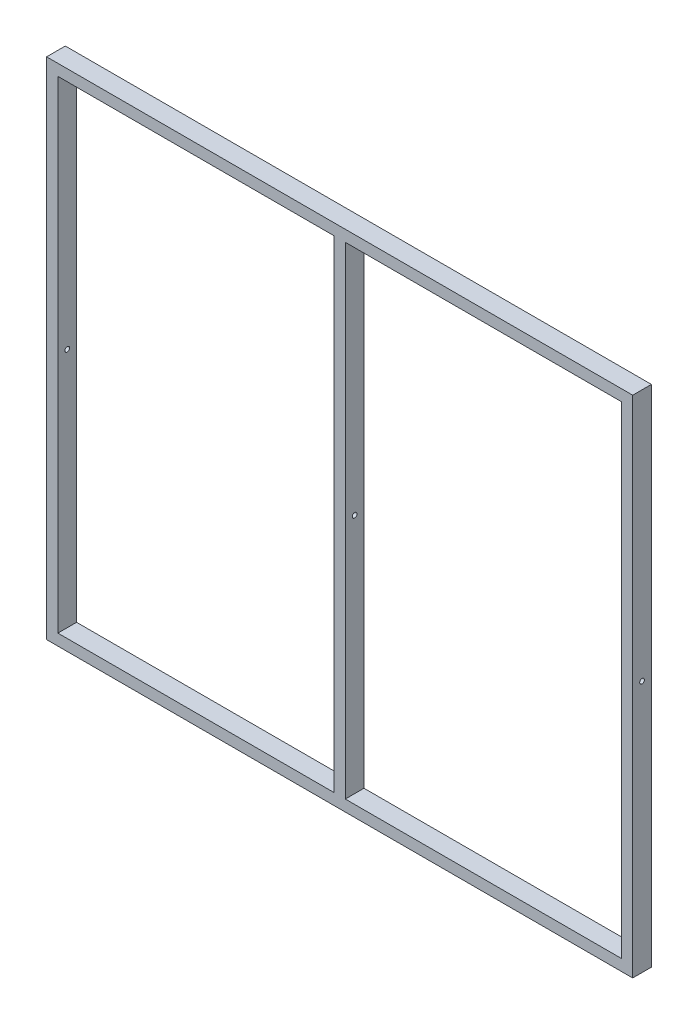
ISO-10303-21;
HEADER;
FILE_DESCRIPTION(('STEP AP214'),'2;1');
FILE_NAME('part.step','',(''),(''),'','','');
FILE_SCHEMA(('AUTOMOTIVE_DESIGN { 1 0 10303 214 1 1 1 1 }'));
ENDSEC;
DATA;
#1=APPLICATION_CONTEXT('core data for automotive mechanical design processes');
#2=APPLICATION_PROTOCOL_DEFINITION('international standard','automotive_design',2000,#1);
#3=PRODUCT_CONTEXT('',#1,'mechanical');
#4=PRODUCT('Part','Part','',(#3));
#5=PRODUCT_RELATED_PRODUCT_CATEGORY('part','',(#4));
#6=PRODUCT_DEFINITION_FORMATION('','',#4);
#7=PRODUCT_DEFINITION_CONTEXT('part definition',#1,'design');
#8=PRODUCT_DEFINITION('design','',#6,#7);
#9=PRODUCT_DEFINITION_SHAPE('','',#8);
#10=(LENGTH_UNIT() NAMED_UNIT(*) SI_UNIT(.MILLI.,.METRE.));
#11=(NAMED_UNIT(*) PLANE_ANGLE_UNIT() SI_UNIT($,.RADIAN.));
#12=(NAMED_UNIT(*) SI_UNIT($,.STERADIAN.) SOLID_ANGLE_UNIT());
#13=UNCERTAINTY_MEASURE_WITH_UNIT(LENGTH_MEASURE(1.E-05),#10,'distance_accuracy_value','');
#14=(GEOMETRIC_REPRESENTATION_CONTEXT(3) GLOBAL_UNCERTAINTY_ASSIGNED_CONTEXT((#13)) GLOBAL_UNIT_ASSIGNED_CONTEXT((#10,
#11,#12)) REPRESENTATION_CONTEXT('',''));
#15=CARTESIAN_POINT('',(0.,0.,0.));
#16=DIRECTION('',(0.,0.,1.));
#17=DIRECTION('',(1.,0.,0.));
#18=AXIS2_PLACEMENT_3D('',#15,#16,#17);
#19=CARTESIAN_POINT('',(0.,1662.,63.));
#20=DIRECTION('',(0.,1.,0.));
#21=DIRECTION('',(0.,0.,1.));
#22=AXIS2_PLACEMENT_3D('',#19,#20,#21);
#23=PLANE('',#22);
#24=DIRECTION('',(1.,0.,0.));
#25=VECTOR('',#24,1.);
#26=CARTESIAN_POINT('',(0.,1662.,0.));
#27=LINE('',#26,#25);
#28=CARTESIAN_POINT('',(38.0000000000002,1662.,0.));
#29=VERTEX_POINT('',#28);
#30=CARTESIAN_POINT('',(968.,1662.,0.));
#31=VERTEX_POINT('',#30);
#32=EDGE_CURVE('E180',#29,#31,#27,.T.);
#33=ORIENTED_EDGE('',*,*,#32,.T.);
#34=DIRECTION('',(0.,0.,-1.));
#35=VECTOR('',#34,1.);
#36=CARTESIAN_POINT('',(968.,1662.,63.));
#37=LINE('',#36,#35);
#38=CARTESIAN_POINT('',(968.,1662.,63.));
#39=VERTEX_POINT('',#38);
#40=EDGE_CURVE('E11',#39,#31,#37,.T.);
#41=ORIENTED_EDGE('',*,*,#40,.F.);
#42=DIRECTION('',(1.,0.,0.));
#43=VECTOR('',#42,1.);
#44=CARTESIAN_POINT('',(0.,1662.,63.));
#45=LINE('',#44,#43);
#46=CARTESIAN_POINT('',(38.0000000000002,1662.,63.));
#47=VERTEX_POINT('',#46);
#48=EDGE_CURVE('E139',#47,#39,#45,.T.);
#49=ORIENTED_EDGE('',*,*,#48,.F.);
#50=DIRECTION('',(0.,0.,-1.));
#51=VECTOR('',#50,1.);
#52=CARTESIAN_POINT('',(38.0000000000002,1662.,63.));
#53=LINE('',#52,#51);
#54=EDGE_CURVE('E54',#47,#29,#53,.T.);
#55=ORIENTED_EDGE('',*,*,#54,.T.);
#56=EDGE_LOOP('',(#33,#41,#49,#55));
#57=FACE_BOUND('',#56,.T.);
#58=ADVANCED_FACE('F35',(#57),#23,.F.);
#59=CARTESIAN_POINT('',(968.,0.,63.));
#60=DIRECTION('',(1.,0.,0.));
#61=DIRECTION('',(0.,0.,-1.));
#62=AXIS2_PLACEMENT_3D('',#59,#60,#61);
#63=PLANE('',#62);
#64=CARTESIAN_POINT('',(968.,850.,31.5));
#65=DIRECTION('',(1.,0.,0.));
#66=DIRECTION('',(0.,0.,-1.));
#67=AXIS2_PLACEMENT_3D('',#64,#65,#66);
#68=CIRCLE('',#67,8.00000000000001);
#69=CARTESIAN_POINT('',(968.,850.,23.5));
#70=VERTEX_POINT('',#69);
#71=EDGE_CURVE('E160',#70,#70,#68,.T.);
#72=ORIENTED_EDGE('',*,*,#71,.T.);
#73=EDGE_LOOP('',(#72));
#74=FACE_BOUND('',#73,.T.);
#75=DIRECTION('',(0.,-1.,0.));
#76=VECTOR('',#75,1.);
#77=CARTESIAN_POINT('',(968.,0.,0.));
#78=LINE('',#77,#76);
#79=CARTESIAN_POINT('',(968.,38.,0.));
#80=VERTEX_POINT('',#79);
#81=EDGE_CURVE('E145',#31,#80,#78,.T.);
#82=ORIENTED_EDGE('',*,*,#81,.T.);
#83=DIRECTION('',(0.,0.,-1.));
#84=VECTOR('',#83,1.);
#85=CARTESIAN_POINT('',(968.,38.,63.));
#86=LINE('',#85,#84);
#87=CARTESIAN_POINT('',(968.,38.,63.));
#88=VERTEX_POINT('',#87);
#89=EDGE_CURVE('E45',#88,#80,#86,.T.);
#90=ORIENTED_EDGE('',*,*,#89,.F.);
#91=DIRECTION('',(0.,-1.,0.));
#92=VECTOR('',#91,1.);
#93=CARTESIAN_POINT('',(968.,0.,63.));
#94=LINE('',#93,#92);
#95=EDGE_CURVE('E133',#39,#88,#94,.T.);
#96=ORIENTED_EDGE('',*,*,#95,.F.);
#97=ORIENTED_EDGE('',*,*,#40,.T.);
#98=EDGE_LOOP('',(#82,#90,#96,#97));
#99=FACE_BOUND('',#98,.T.);
#100=ADVANCED_FACE('F144',(#74,#99),#63,.F.);
#101=CARTESIAN_POINT('',(0.,38.,63.));
#102=DIRECTION('',(0.,1.,0.));
#103=DIRECTION('',(0.,0.,1.));
#104=AXIS2_PLACEMENT_3D('',#101,#102,#103);
#105=PLANE('',#104);
#106=DIRECTION('',(1.,0.,0.));
#107=VECTOR('',#106,1.);
#108=CARTESIAN_POINT('',(0.,38.,0.));
#109=LINE('',#108,#107);
#110=CARTESIAN_POINT('',(38.0000000000001,38.,0.));
#111=VERTEX_POINT('',#110);
#112=EDGE_CURVE('E183',#111,#80,#109,.T.);
#113=ORIENTED_EDGE('',*,*,#112,.F.);
#114=DIRECTION('',(0.,0.,-1.));
#115=VECTOR('',#114,1.);
#116=CARTESIAN_POINT('',(38.0000000000001,38.,63.));
#117=LINE('',#116,#115);
#118=CARTESIAN_POINT('',(38.0000000000001,38.,63.));
#119=VERTEX_POINT('',#118);
#120=EDGE_CURVE('E92',#119,#111,#117,.T.);
#121=ORIENTED_EDGE('',*,*,#120,.F.);
#122=DIRECTION('',(1.,0.,0.));
#123=VECTOR('',#122,1.);
#124=CARTESIAN_POINT('',(0.,38.,63.));
#125=LINE('',#124,#123);
#126=EDGE_CURVE('E138',#119,#88,#125,.T.);
#127=ORIENTED_EDGE('',*,*,#126,.T.);
#128=ORIENTED_EDGE('',*,*,#89,.T.);
#129=EDGE_LOOP('',(#113,#121,#127,#128));
#130=FACE_BOUND('',#129,.T.);
#131=ADVANCED_FACE('F149',(#130),#105,.T.);
#132=CARTESIAN_POINT('',(0.,0.,63.));
#133=DIRECTION('',(0.,1.,0.));
#134=DIRECTION('',(0.,0.,1.));
#135=AXIS2_PLACEMENT_3D('',#132,#133,#134);
#136=PLANE('',#135);
#137=DIRECTION('',(1.,0.,0.));
#138=VECTOR('',#137,1.);
#139=CARTESIAN_POINT('',(0.,0.,0.));
#140=LINE('',#139,#138);
#141=CARTESIAN_POINT('',(0.,0.,0.));
#142=VERTEX_POINT('',#141);
#143=CARTESIAN_POINT('',(1974.,0.,0.));
#144=VERTEX_POINT('',#143);
#145=EDGE_CURVE('E168',#142,#144,#140,.T.);
#146=ORIENTED_EDGE('',*,*,#145,.T.);
#147=DIRECTION('',(0.,0.,-1.));
#148=VECTOR('',#147,1.);
#149=CARTESIAN_POINT('',(1974.,0.,63.));
#150=LINE('',#149,#148);
#151=CARTESIAN_POINT('',(1974.,0.,63.));
#152=VERTEX_POINT('',#151);
#153=EDGE_CURVE('E190',#152,#144,#150,.T.);
#154=ORIENTED_EDGE('',*,*,#153,.F.);
#155=DIRECTION('',(1.,0.,0.));
#156=VECTOR('',#155,1.);
#157=CARTESIAN_POINT('',(0.,0.,63.));
#158=LINE('',#157,#156);
#159=CARTESIAN_POINT('',(0.,0.,63.));
#160=VERTEX_POINT('',#159);
#161=EDGE_CURVE('E228',#160,#152,#158,.T.);
#162=ORIENTED_EDGE('',*,*,#161,.F.);
#163=DIRECTION('',(0.,0.,-1.));
#164=VECTOR('',#163,1.);
#165=CARTESIAN_POINT('',(0.,0.,63.));
#166=LINE('',#165,#164);
#167=EDGE_CURVE('E192',#160,#142,#166,.T.);
#168=ORIENTED_EDGE('',*,*,#167,.T.);
#169=EDGE_LOOP('',(#146,#154,#162,#168));
#170=FACE_BOUND('',#169,.T.);
#171=ADVANCED_FACE('F257',(#170),#136,.F.);
#172=CARTESIAN_POINT('',(1974.,0.,63.));
#173=DIRECTION('',(-1.,0.,0.));
#174=DIRECTION('',(0.,0.,1.));
#175=AXIS2_PLACEMENT_3D('',#172,#173,#174);
#176=PLANE('',#175);
#177=CARTESIAN_POINT('',(1974.,850.,31.5));
#178=DIRECTION('',(1.,0.,0.));
#179=DIRECTION('',(0.,0.,-1.));
#180=AXIS2_PLACEMENT_3D('',#177,#178,#179);
#181=CIRCLE('',#180,8.00000000000001);
#182=CARTESIAN_POINT('',(1974.,850.,23.5));
#183=VERTEX_POINT('',#182);
#184=EDGE_CURVE('E293',#183,#183,#181,.T.);
#185=ORIENTED_EDGE('',*,*,#184,.F.);
#186=EDGE_LOOP('',(#185));
#187=FACE_BOUND('',#186,.T.);
#188=DIRECTION('',(0.,1.,0.));
#189=VECTOR('',#188,1.);
#190=CARTESIAN_POINT('',(1974.,0.,0.));
#191=LINE('',#190,#189);
#192=CARTESIAN_POINT('',(1974.,1700.,0.));
#193=VERTEX_POINT('',#192);
#194=EDGE_CURVE('E171',#144,#193,#191,.T.);
#195=ORIENTED_EDGE('',*,*,#194,.T.);
#196=DIRECTION('',(0.,0.,-1.));
#197=VECTOR('',#196,1.);
#198=CARTESIAN_POINT('',(1974.,1700.,63.));
#199=LINE('',#198,#197);
#200=CARTESIAN_POINT('',(1974.,1700.,63.));
#201=VERTEX_POINT('',#200);
#202=EDGE_CURVE('E196',#201,#193,#199,.T.);
#203=ORIENTED_EDGE('',*,*,#202,.F.);
#204=DIRECTION('',(0.,1.,0.));
#205=VECTOR('',#204,1.);
#206=CARTESIAN_POINT('',(1974.,0.,63.));
#207=LINE('',#206,#205);
#208=EDGE_CURVE('E235',#152,#201,#207,.T.);
#209=ORIENTED_EDGE('',*,*,#208,.F.);
#210=ORIENTED_EDGE('',*,*,#153,.T.);
#211=EDGE_LOOP('',(#195,#203,#209,#210));
#212=FACE_BOUND('',#211,.T.);
#213=ADVANCED_FACE('F259',(#187,#212),#176,.F.);
#214=CARTESIAN_POINT('',(0.,1700.,63.));
#215=DIRECTION('',(0.,1.,0.));
#216=DIRECTION('',(0.,0.,1.));
#217=AXIS2_PLACEMENT_3D('',#214,#215,#216);
#218=PLANE('',#217);
#219=DIRECTION('',(1.,0.,0.));
#220=VECTOR('',#219,1.);
#221=CARTESIAN_POINT('',(0.,1700.,0.));
#222=LINE('',#221,#220);
#223=CARTESIAN_POINT('',(0.,1700.,0.));
#224=VERTEX_POINT('',#223);
#225=EDGE_CURVE('E174',#224,#193,#222,.T.);
#226=ORIENTED_EDGE('',*,*,#225,.F.);
#227=DIRECTION('',(0.,0.,-1.));
#228=VECTOR('',#227,1.);
#229=CARTESIAN_POINT('',(0.,1700.,63.));
#230=LINE('',#229,#228);
#231=CARTESIAN_POINT('',(0.,1700.,63.));
#232=VERTEX_POINT('',#231);
#233=EDGE_CURVE('E194',#232,#224,#230,.T.);
#234=ORIENTED_EDGE('',*,*,#233,.F.);
#235=DIRECTION('',(1.,0.,0.));
#236=VECTOR('',#235,1.);
#237=CARTESIAN_POINT('',(0.,1700.,63.));
#238=LINE('',#237,#236);
#239=EDGE_CURVE('E237',#232,#201,#238,.T.);
#240=ORIENTED_EDGE('',*,*,#239,.T.);
#241=ORIENTED_EDGE('',*,*,#202,.T.);
#242=EDGE_LOOP('',(#226,#234,#240,#241));
#243=FACE_BOUND('',#242,.T.);
#244=ADVANCED_FACE('F253',(#243),#218,.T.);
#245=CARTESIAN_POINT('',(0.,1662.,63.));
#246=DIRECTION('',(0.,-1.,0.));
#247=DIRECTION('',(0.,0.,-1.));
#248=AXIS2_PLACEMENT_3D('',#245,#246,#247);
#249=PLANE('',#248);
#250=DIRECTION('',(-1.,0.,0.));
#251=VECTOR('',#250,1.);
#252=CARTESIAN_POINT('',(0.,1662.,0.));
#253=LINE('',#252,#251);
#254=CARTESIAN_POINT('',(1936.,1662.,0.));
#255=VERTEX_POINT('',#254);
#256=CARTESIAN_POINT('',(1006.,1662.,0.));
#257=VERTEX_POINT('',#256);
#258=EDGE_CURVE('E156',#255,#257,#253,.T.);
#259=ORIENTED_EDGE('',*,*,#258,.F.);
#260=DIRECTION('',(0.,0.,-1.));
#261=VECTOR('',#260,1.);
#262=CARTESIAN_POINT('',(1936.,1662.,63.));
#263=LINE('',#262,#261);
#264=CARTESIAN_POINT('',(1936.,1662.,63.));
#265=VERTEX_POINT('',#264);
#266=EDGE_CURVE('E104',#265,#255,#263,.T.);
#267=ORIENTED_EDGE('',*,*,#266,.F.);
#268=DIRECTION('',(-1.,0.,0.));
#269=VECTOR('',#268,1.);
#270=CARTESIAN_POINT('',(0.,1662.,63.));
#271=LINE('',#270,#269);
#272=CARTESIAN_POINT('',(1006.,1662.,63.));
#273=VERTEX_POINT('',#272);
#274=EDGE_CURVE('E188',#265,#273,#271,.T.);
#275=ORIENTED_EDGE('',*,*,#274,.T.);
#276=DIRECTION('',(0.,0.,-1.));
#277=VECTOR('',#276,1.);
#278=CARTESIAN_POINT('',(1006.,1662.,63.));
#279=LINE('',#278,#277);
#280=EDGE_CURVE('E152',#273,#257,#279,.T.);
#281=ORIENTED_EDGE('',*,*,#280,.T.);
#282=EDGE_LOOP('',(#259,#267,#275,#281));
#283=FACE_BOUND('',#282,.T.);
#284=ADVANCED_FACE('F37',(#283),#249,.T.);
#285=CARTESIAN_POINT('',(1936.,0.,63.));
#286=DIRECTION('',(1.,0.,0.));
#287=DIRECTION('',(0.,0.,-1.));
#288=AXIS2_PLACEMENT_3D('',#285,#286,#287);
#289=PLANE('',#288);
#290=CARTESIAN_POINT('',(1936.,850.,31.5));
#291=DIRECTION('',(1.,0.,0.));
#292=DIRECTION('',(0.,0.,-1.));
#293=AXIS2_PLACEMENT_3D('',#290,#291,#292);
#294=CIRCLE('',#293,8.00000000000001);
#295=CARTESIAN_POINT('',(1936.,850.,23.5));
#296=VERTEX_POINT('',#295);
#297=EDGE_CURVE('E302',#296,#296,#294,.T.);
#298=ORIENTED_EDGE('',*,*,#297,.T.);
#299=EDGE_LOOP('',(#298));
#300=FACE_BOUND('',#299,.T.);
#301=DIRECTION('',(0.,-1.,0.));
#302=VECTOR('',#301,1.);
#303=CARTESIAN_POINT('',(1936.,0.,0.));
#304=LINE('',#303,#302);
#305=CARTESIAN_POINT('',(1936.,38.,0.));
#306=VERTEX_POINT('',#305);
#307=EDGE_CURVE('E159',#255,#306,#304,.T.);
#308=ORIENTED_EDGE('',*,*,#307,.T.);
#309=DIRECTION('',(0.,0.,-1.));
#310=VECTOR('',#309,1.);
#311=CARTESIAN_POINT('',(1936.,38.,63.));
#312=LINE('',#311,#310);
#313=CARTESIAN_POINT('',(1936.,38.,63.));
#314=VERTEX_POINT('',#313);
#315=EDGE_CURVE('E203',#314,#306,#312,.T.);
#316=ORIENTED_EDGE('',*,*,#315,.F.);
#317=DIRECTION('',(0.,-1.,0.));
#318=VECTOR('',#317,1.);
#319=CARTESIAN_POINT('',(1936.,0.,63.));
#320=LINE('',#319,#318);
#321=EDGE_CURVE('E209',#265,#314,#320,.T.);
#322=ORIENTED_EDGE('',*,*,#321,.F.);
#323=ORIENTED_EDGE('',*,*,#266,.T.);
#324=EDGE_LOOP('',(#308,#316,#322,#323));
#325=FACE_BOUND('',#324,.T.);
#326=ADVANCED_FACE('F207',(#300,#325),#289,.F.);
#327=CARTESIAN_POINT('',(0.,38.,63.));
#328=DIRECTION('',(0.,-1.,0.));
#329=DIRECTION('',(0.,0.,-1.));
#330=AXIS2_PLACEMENT_3D('',#327,#328,#329);
#331=PLANE('',#330);
#332=DIRECTION('',(-1.,0.,0.));
#333=VECTOR('',#332,1.);
#334=CARTESIAN_POINT('',(0.,38.,0.));
#335=LINE('',#334,#333);
#336=CARTESIAN_POINT('',(1006.,38.,0.));
#337=VERTEX_POINT('',#336);
#338=EDGE_CURVE('E162',#306,#337,#335,.T.);
#339=ORIENTED_EDGE('',*,*,#338,.T.);
#340=DIRECTION('',(0.,0.,-1.));
#341=VECTOR('',#340,1.);
#342=CARTESIAN_POINT('',(1006.,38.,63.));
#343=LINE('',#342,#341);
#344=CARTESIAN_POINT('',(1006.,38.,63.));
#345=VERTEX_POINT('',#344);
#346=EDGE_CURVE('E201',#345,#337,#343,.T.);
#347=ORIENTED_EDGE('',*,*,#346,.F.);
#348=DIRECTION('',(-1.,0.,0.));
#349=VECTOR('',#348,1.);
#350=CARTESIAN_POINT('',(0.,38.,63.));
#351=LINE('',#350,#349);
#352=EDGE_CURVE('E225',#314,#345,#351,.T.);
#353=ORIENTED_EDGE('',*,*,#352,.F.);
#354=ORIENTED_EDGE('',*,*,#315,.T.);
#355=EDGE_LOOP('',(#339,#347,#353,#354));
#356=FACE_BOUND('',#355,.T.);
#357=ADVANCED_FACE('F224',(#356),#331,.F.);
#358=CARTESIAN_POINT('',(0.,0.,63.));
#359=DIRECTION('',(-1.,0.,0.));
#360=DIRECTION('',(0.,0.,1.));
#361=AXIS2_PLACEMENT_3D('',#358,#359,#360);
#362=PLANE('',#361);
#363=CARTESIAN_POINT('',(0.,850.,31.5));
#364=DIRECTION('',(1.,0.,0.));
#365=DIRECTION('',(0.,0.,-1.));
#366=AXIS2_PLACEMENT_3D('',#363,#364,#365);
#367=CIRCLE('',#366,8.00000000000001);
#368=CARTESIAN_POINT('',(0.,850.,23.5));
#369=VERTEX_POINT('',#368);
#370=EDGE_CURVE('E291',#369,#369,#367,.T.);
#371=ORIENTED_EDGE('',*,*,#370,.T.);
#372=EDGE_LOOP('',(#371));
#373=FACE_BOUND('',#372,.T.);
#374=DIRECTION('',(0.,1.,0.));
#375=VECTOR('',#374,1.);
#376=CARTESIAN_POINT('',(0.,0.,0.));
#377=LINE('',#376,#375);
#378=EDGE_CURVE('E177',#142,#224,#377,.T.);
#379=ORIENTED_EDGE('',*,*,#378,.F.);
#380=ORIENTED_EDGE('',*,*,#167,.F.);
#381=DIRECTION('',(0.,1.,0.));
#382=VECTOR('',#381,1.);
#383=CARTESIAN_POINT('',(0.,0.,63.));
#384=LINE('',#383,#382);
#385=EDGE_CURVE('E240',#160,#232,#384,.T.);
#386=ORIENTED_EDGE('',*,*,#385,.T.);
#387=ORIENTED_EDGE('',*,*,#233,.T.);
#388=EDGE_LOOP('',(#379,#380,#386,#387));
#389=FACE_BOUND('',#388,.T.);
#390=ADVANCED_FACE('F245',(#373,#389),#362,.T.);
#391=CARTESIAN_POINT('',(1006.,0.,63.));
#392=DIRECTION('',(1.,0.,0.));
#393=DIRECTION('',(0.,0.,-1.));
#394=AXIS2_PLACEMENT_3D('',#391,#392,#393);
#395=PLANE('',#394);
#396=CARTESIAN_POINT('',(1006.,850.,31.5));
#397=DIRECTION('',(1.,0.,0.));
#398=DIRECTION('',(0.,0.,-1.));
#399=AXIS2_PLACEMENT_3D('',#396,#397,#398);
#400=CIRCLE('',#399,8.00000000000001);
#401=CARTESIAN_POINT('',(1006.,850.,23.5));
#402=VERTEX_POINT('',#401);
#403=EDGE_CURVE('E296',#402,#402,#400,.T.);
#404=ORIENTED_EDGE('',*,*,#403,.F.);
#405=EDGE_LOOP('',(#404));
#406=FACE_BOUND('',#405,.T.);
#407=DIRECTION('',(0.,-1.,0.));
#408=VECTOR('',#407,1.);
#409=CARTESIAN_POINT('',(1006.,0.,0.));
#410=LINE('',#409,#408);
#411=EDGE_CURVE('E165',#257,#337,#410,.T.);
#412=ORIENTED_EDGE('',*,*,#411,.F.);
#413=ORIENTED_EDGE('',*,*,#280,.F.);
#414=DIRECTION('',(0.,-1.,0.));
#415=VECTOR('',#414,1.);
#416=CARTESIAN_POINT('',(1006.,0.,63.));
#417=LINE('',#416,#415);
#418=EDGE_CURVE('E220',#273,#345,#417,.T.);
#419=ORIENTED_EDGE('',*,*,#418,.T.);
#420=ORIENTED_EDGE('',*,*,#346,.T.);
#421=EDGE_LOOP('',(#412,#413,#419,#420));
#422=FACE_BOUND('',#421,.T.);
#423=ADVANCED_FACE('F219',(#406,#422),#395,.T.);
#424=CARTESIAN_POINT('',(38.0000000000001,0.,63.));
#425=DIRECTION('',(1.,0.,0.));
#426=DIRECTION('',(0.,1.,0.));
#427=AXIS2_PLACEMENT_3D('',#424,#425,#426);
#428=PLANE('',#427);
#429=CARTESIAN_POINT('',(38.0000000000001,850.,31.5));
#430=DIRECTION('',(1.,0.,0.));
#431=DIRECTION('',(0.,1.,0.));
#432=AXIS2_PLACEMENT_3D('',#429,#430,#431);
#433=CIRCLE('',#432,8.00000000000001);
#434=CARTESIAN_POINT('',(38.0000000000001,858.,31.5));
#435=VERTEX_POINT('',#434);
#436=EDGE_CURVE('E39',#435,#435,#433,.T.);
#437=ORIENTED_EDGE('',*,*,#436,.F.);
#438=EDGE_LOOP('',(#437));
#439=FACE_BOUND('',#438,.T.);
#440=DIRECTION('',(0.,-1.,0.));
#441=VECTOR('',#440,1.);
#442=CARTESIAN_POINT('',(38.0000000000001,0.,0.));
#443=LINE('',#442,#441);
#444=EDGE_CURVE('E185',#29,#111,#443,.T.);
#445=ORIENTED_EDGE('',*,*,#444,.F.);
#446=ORIENTED_EDGE('',*,*,#54,.F.);
#447=DIRECTION('',(0.,-1.,0.));
#448=VECTOR('',#447,1.);
#449=CARTESIAN_POINT('',(38.0000000000001,0.,63.));
#450=LINE('',#449,#448);
#451=EDGE_CURVE('E150',#47,#119,#450,.T.);
#452=ORIENTED_EDGE('',*,*,#451,.T.);
#453=ORIENTED_EDGE('',*,*,#120,.T.);
#454=EDGE_LOOP('',(#445,#446,#452,#453));
#455=FACE_BOUND('',#454,.T.);
#456=ADVANCED_FACE('F285',(#439,#455),#428,.T.);
#457=CARTESIAN_POINT('',(0.,0.,63.));
#458=DIRECTION('',(0.,0.,1.));
#459=DIRECTION('',(1.,0.,0.));
#460=AXIS2_PLACEMENT_3D('',#457,#458,#459);
#461=PLANE('',#460);
#462=ORIENTED_EDGE('',*,*,#274,.F.);
#463=ORIENTED_EDGE('',*,*,#321,.T.);
#464=ORIENTED_EDGE('',*,*,#352,.T.);
#465=ORIENTED_EDGE('',*,*,#418,.F.);
#466=EDGE_LOOP('',(#462,#463,#464,#465));
#467=FACE_BOUND('',#466,.T.);
#468=ORIENTED_EDGE('',*,*,#161,.T.);
#469=ORIENTED_EDGE('',*,*,#208,.T.);
#470=ORIENTED_EDGE('',*,*,#239,.F.);
#471=ORIENTED_EDGE('',*,*,#385,.F.);
#472=EDGE_LOOP('',(#468,#469,#470,#471));
#473=FACE_BOUND('',#472,.T.);
#474=ORIENTED_EDGE('',*,*,#48,.T.);
#475=ORIENTED_EDGE('',*,*,#95,.T.);
#476=ORIENTED_EDGE('',*,*,#126,.F.);
#477=ORIENTED_EDGE('',*,*,#451,.F.);
#478=EDGE_LOOP('',(#474,#475,#476,#477));
#479=FACE_BOUND('',#478,.T.);
#480=ADVANCED_FACE('F135',(#467,#473,#479),#461,.T.);
#481=CARTESIAN_POINT('',(0.,0.,0.));
#482=DIRECTION('',(0.,0.,1.));
#483=DIRECTION('',(1.,0.,0.));
#484=AXIS2_PLACEMENT_3D('',#481,#482,#483);
#485=PLANE('',#484);
#486=ORIENTED_EDGE('',*,*,#258,.T.);
#487=ORIENTED_EDGE('',*,*,#411,.T.);
#488=ORIENTED_EDGE('',*,*,#338,.F.);
#489=ORIENTED_EDGE('',*,*,#307,.F.);
#490=EDGE_LOOP('',(#486,#487,#488,#489));
#491=FACE_BOUND('',#490,.T.);
#492=ORIENTED_EDGE('',*,*,#145,.F.);
#493=ORIENTED_EDGE('',*,*,#378,.T.);
#494=ORIENTED_EDGE('',*,*,#225,.T.);
#495=ORIENTED_EDGE('',*,*,#194,.F.);
#496=EDGE_LOOP('',(#492,#493,#494,#495));
#497=FACE_BOUND('',#496,.T.);
#498=ORIENTED_EDGE('',*,*,#32,.F.);
#499=ORIENTED_EDGE('',*,*,#444,.T.);
#500=ORIENTED_EDGE('',*,*,#112,.T.);
#501=ORIENTED_EDGE('',*,*,#81,.F.);
#502=EDGE_LOOP('',(#498,#499,#500,#501));
#503=FACE_BOUND('',#502,.T.);
#504=ADVANCED_FACE('F213',(#491,#497,#503),#485,.F.);
#505=CARTESIAN_POINT('',(0.,850.,31.5));
#506=DIRECTION('',(1.,0.,0.));
#507=DIRECTION('',(0.,0.,-1.));
#508=AXIS2_PLACEMENT_3D('',#505,#506,#507);
#509=CYLINDRICAL_SURFACE('',#508,8.00000000000001);
#510=ORIENTED_EDGE('',*,*,#436,.T.);
#511=EDGE_LOOP('',(#510));
#512=FACE_BOUND('',#511,.T.);
#513=ORIENTED_EDGE('',*,*,#370,.F.);
#514=EDGE_LOOP('',(#513));
#515=FACE_BOUND('',#514,.T.);
#516=ADVANCED_FACE('F311',(#512,#515),#509,.F.);
#517=ORIENTED_EDGE('',*,*,#403,.T.);
#518=EDGE_LOOP('',(#517));
#519=FACE_BOUND('',#518,.T.);
#520=ORIENTED_EDGE('',*,*,#71,.F.);
#521=EDGE_LOOP('',(#520));
#522=FACE_BOUND('',#521,.T.);
#523=ADVANCED_FACE('F308',(#519,#522),#509,.F.);
#524=ORIENTED_EDGE('',*,*,#184,.T.);
#525=EDGE_LOOP('',(#524));
#526=FACE_BOUND('',#525,.T.);
#527=ORIENTED_EDGE('',*,*,#297,.F.);
#528=EDGE_LOOP('',(#527));
#529=FACE_BOUND('',#528,.T.);
#530=ADVANCED_FACE('F310',(#526,#529),#509,.F.);
#531=CLOSED_SHELL('',(#58,#100,#131,#171,#213,#244,#284,#326,#357,#390,#423,#456,#480,#504,#516,
#523,#530));
#532=MANIFOLD_SOLID_BREP('B2',#531);
#533=ADVANCED_BREP_SHAPE_REPRESENTATION('',(#18,#532),#14);
#534=SHAPE_DEFINITION_REPRESENTATION(#9,#533);
ENDSEC;
END-ISO-10303-21;
